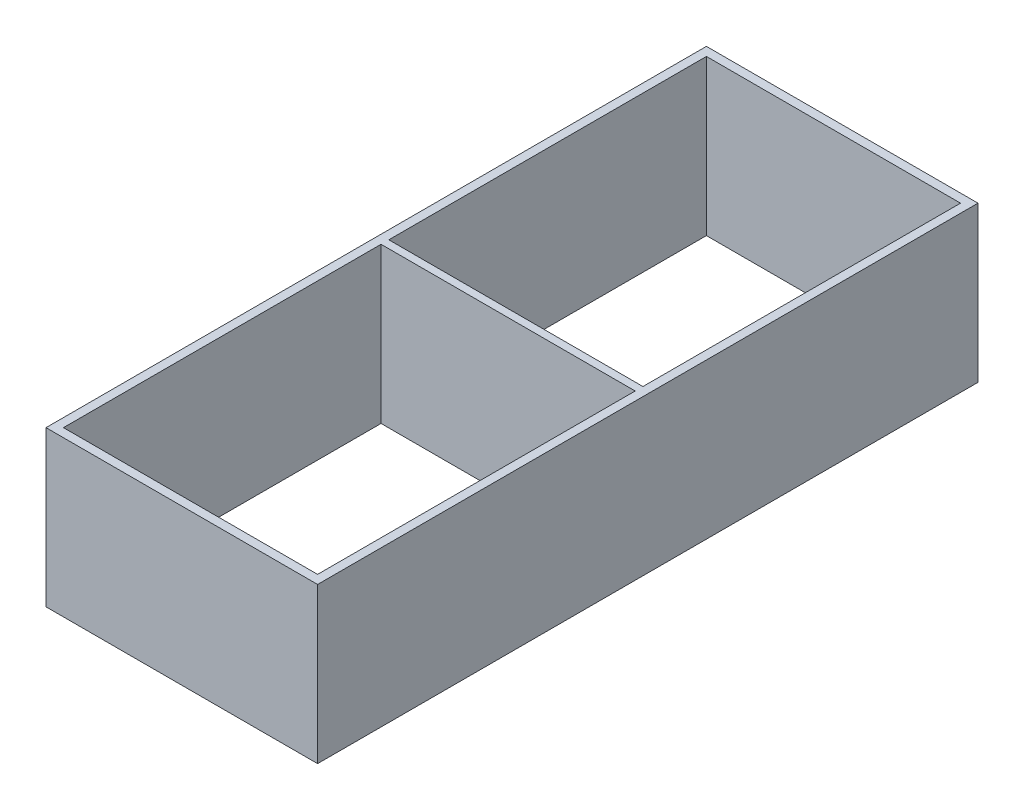
ISO-10303-21;
HEADER;
FILE_DESCRIPTION(('STEP AP214'),'2;1');
FILE_NAME('part.step','',(''),(''),'','','');
FILE_SCHEMA(('AUTOMOTIVE_DESIGN { 1 0 10303 214 1 1 1 1 }'));
ENDSEC;
DATA;
#1=APPLICATION_CONTEXT('core data for automotive mechanical design processes');
#2=APPLICATION_PROTOCOL_DEFINITION('international standard','automotive_design',2000,#1);
#3=PRODUCT_CONTEXT('',#1,'mechanical');
#4=PRODUCT('Part','Part','',(#3));
#5=PRODUCT_RELATED_PRODUCT_CATEGORY('part','',(#4));
#6=PRODUCT_DEFINITION_FORMATION('','',#4);
#7=PRODUCT_DEFINITION_CONTEXT('part definition',#1,'design');
#8=PRODUCT_DEFINITION('design','',#6,#7);
#9=PRODUCT_DEFINITION_SHAPE('','',#8);
#10=(LENGTH_UNIT() NAMED_UNIT(*) SI_UNIT(.MILLI.,.METRE.));
#11=(NAMED_UNIT(*) PLANE_ANGLE_UNIT() SI_UNIT($,.RADIAN.));
#12=(NAMED_UNIT(*) SI_UNIT($,.STERADIAN.) SOLID_ANGLE_UNIT());
#13=UNCERTAINTY_MEASURE_WITH_UNIT(LENGTH_MEASURE(1.E-05),#10,'distance_accuracy_value','');
#14=(GEOMETRIC_REPRESENTATION_CONTEXT(3) GLOBAL_UNCERTAINTY_ASSIGNED_CONTEXT((#13)) GLOBAL_UNIT_ASSIGNED_CONTEXT((#10,
#11,#12)) REPRESENTATION_CONTEXT('',''));
#15=CARTESIAN_POINT('',(0.,0.,0.));
#16=DIRECTION('',(0.,0.,1.));
#17=DIRECTION('',(1.,0.,0.));
#18=AXIS2_PLACEMENT_3D('',#15,#16,#17);
#19=CARTESIAN_POINT('',(0.,119.,0.));
#20=DIRECTION('',(0.,-1.,0.));
#21=DIRECTION('',(0.,0.,-1.));
#22=AXIS2_PLACEMENT_3D('',#19,#20,#21);
#23=PLANE('',#22);
#24=DIRECTION('',(0.,0.,1.));
#25=VECTOR('',#24,1.);
#26=CARTESIAN_POINT('',(-55.5,119.,2.));
#27=LINE('',#26,#25);
#28=CARTESIAN_POINT('',(-55.5,119.,2.));
#29=VERTEX_POINT('',#28);
#30=CARTESIAN_POINT('',(-55.5,119.,165.713675074596));
#31=VERTEX_POINT('',#30);
#32=EDGE_CURVE('E154',#29,#31,#27,.T.);
#33=ORIENTED_EDGE('',*,*,#32,.F.);
#34=DIRECTION('',(-1.,0.,0.));
#35=VECTOR('',#34,1.);
#36=CARTESIAN_POINT('',(-55.5,119.,2.));
#37=LINE('',#36,#35);
#38=CARTESIAN_POINT('',(75.5,119.,2.));
#39=VERTEX_POINT('',#38);
#40=EDGE_CURVE('E160',#39,#29,#37,.T.);
#41=ORIENTED_EDGE('',*,*,#40,.F.);
#42=DIRECTION('',(0.,0.,-1.));
#43=VECTOR('',#42,1.);
#44=CARTESIAN_POINT('',(75.5,119.,2.));
#45=LINE('',#44,#43);
#46=CARTESIAN_POINT('',(75.5,119.,165.713675074596));
#47=VERTEX_POINT('',#46);
#48=EDGE_CURVE('E158',#47,#39,#45,.T.);
#49=ORIENTED_EDGE('',*,*,#48,.F.);
#50=DIRECTION('',(1.,0.,0.));
#51=VECTOR('',#50,1.);
#52=CARTESIAN_POINT('',(-55.5,119.,165.713675074596));
#53=LINE('',#52,#51);
#54=EDGE_CURVE('E156',#31,#47,#53,.T.);
#55=ORIENTED_EDGE('',*,*,#54,.F.);
#56=EDGE_LOOP('',(#33,#41,#49,#55));
#57=FACE_BOUND('',#56,.T.);
#58=DIRECTION('',(0.,0.,-1.));
#59=VECTOR('',#58,1.);
#60=CARTESIAN_POINT('',(-60.,119.,170.213675074596));
#61=LINE('',#60,#59);
#62=CARTESIAN_POINT('',(-60.,119.,170.213675074596));
#63=VERTEX_POINT('',#62);
#64=CARTESIAN_POINT('',(-60.,119.,-170.213675074596));
#65=VERTEX_POINT('',#64);
#66=EDGE_CURVE('E170',#63,#65,#61,.T.);
#67=ORIENTED_EDGE('',*,*,#66,.F.);
#68=DIRECTION('',(-1.,0.,0.));
#69=VECTOR('',#68,1.);
#70=CARTESIAN_POINT('',(-60.,119.,170.213675074596));
#71=LINE('',#70,#69);
#72=CARTESIAN_POINT('',(80.,119.,170.213675074596));
#73=VERTEX_POINT('',#72);
#74=EDGE_CURVE('E180',#73,#63,#71,.T.);
#75=ORIENTED_EDGE('',*,*,#74,.F.);
#76=DIRECTION('',(0.,0.,1.));
#77=VECTOR('',#76,1.);
#78=CARTESIAN_POINT('',(80.,119.,170.213675074596));
#79=LINE('',#78,#77);
#80=CARTESIAN_POINT('',(80.0000000000001,119.,-170.213675074596));
#81=VERTEX_POINT('',#80);
#82=EDGE_CURVE('E177',#81,#73,#79,.T.);
#83=ORIENTED_EDGE('',*,*,#82,.F.);
#84=DIRECTION('',(1.,0.,0.));
#85=VECTOR('',#84,1.);
#86=CARTESIAN_POINT('',(-60.,119.,-170.213675074596));
#87=LINE('',#86,#85);
#88=EDGE_CURVE('E173',#65,#81,#87,.T.);
#89=ORIENTED_EDGE('',*,*,#88,.F.);
#90=EDGE_LOOP('',(#67,#75,#83,#89));
#91=FACE_BOUND('',#90,.T.);
#92=DIRECTION('',(0.,0.,1.));
#93=VECTOR('',#92,1.);
#94=CARTESIAN_POINT('',(-55.5,119.,-165.713675074596));
#95=LINE('',#94,#93);
#96=CARTESIAN_POINT('',(-55.5,119.,-165.713675074596));
#97=VERTEX_POINT('',#96);
#98=CARTESIAN_POINT('',(-55.5,119.,-2.));
#99=VERTEX_POINT('',#98);
#100=EDGE_CURVE('E124',#97,#99,#95,.T.);
#101=ORIENTED_EDGE('',*,*,#100,.F.);
#102=DIRECTION('',(-1.,0.,0.));
#103=VECTOR('',#102,1.);
#104=CARTESIAN_POINT('',(-55.5,119.,-165.713675074596));
#105=LINE('',#104,#103);
#106=CARTESIAN_POINT('',(75.5,119.,-165.713675074596));
#107=VERTEX_POINT('',#106);
#108=EDGE_CURVE('E147',#107,#97,#105,.T.);
#109=ORIENTED_EDGE('',*,*,#108,.F.);
#110=DIRECTION('',(0.,0.,-1.));
#111=VECTOR('',#110,1.);
#112=CARTESIAN_POINT('',(75.5,119.,-165.713675074596));
#113=LINE('',#112,#111);
#114=CARTESIAN_POINT('',(75.5,119.,-2.));
#115=VERTEX_POINT('',#114);
#116=EDGE_CURVE('E145',#115,#107,#113,.T.);
#117=ORIENTED_EDGE('',*,*,#116,.F.);
#118=DIRECTION('',(1.,0.,0.));
#119=VECTOR('',#118,1.);
#120=CARTESIAN_POINT('',(-55.5,119.,-2.));
#121=LINE('',#120,#119);
#122=EDGE_CURVE('E133',#99,#115,#121,.T.);
#123=ORIENTED_EDGE('',*,*,#122,.F.);
#124=EDGE_LOOP('',(#101,#109,#117,#123));
#125=FACE_BOUND('',#124,.T.);
#126=ADVANCED_FACE('F34',(#57,#91,#125),#23,.F.);
#127=CARTESIAN_POINT('',(0.,38.9999999999999,0.));
#128=DIRECTION('',(0.,-1.,0.));
#129=DIRECTION('',(0.,0.,-1.));
#130=AXIS2_PLACEMENT_3D('',#127,#128,#129);
#131=PLANE('',#130);
#132=DIRECTION('',(-1.,0.,0.));
#133=VECTOR('',#132,1.);
#134=CARTESIAN_POINT('',(0.,38.9999999999999,2.));
#135=LINE('',#134,#133);
#136=CARTESIAN_POINT('',(75.5,38.9999999999999,2.));
#137=VERTEX_POINT('',#136);
#138=CARTESIAN_POINT('',(-55.5,38.9999999999999,2.));
#139=VERTEX_POINT('',#138);
#140=EDGE_CURVE('E196',#137,#139,#135,.T.);
#141=ORIENTED_EDGE('',*,*,#140,.T.);
#142=DIRECTION('',(0.,0.,1.));
#143=VECTOR('',#142,1.);
#144=CARTESIAN_POINT('',(-55.5,38.9999999999999,0.));
#145=LINE('',#144,#143);
#146=CARTESIAN_POINT('',(-55.5,38.9999999999999,165.713675074596));
#147=VERTEX_POINT('',#146);
#148=EDGE_CURVE('E210',#139,#147,#145,.T.);
#149=ORIENTED_EDGE('',*,*,#148,.T.);
#150=DIRECTION('',(1.,0.,0.));
#151=VECTOR('',#150,1.);
#152=CARTESIAN_POINT('',(0.,38.9999999999999,165.713675074596));
#153=LINE('',#152,#151);
#154=CARTESIAN_POINT('',(75.5,38.9999999999999,165.713675074596));
#155=VERTEX_POINT('',#154);
#156=EDGE_CURVE('E207',#147,#155,#153,.T.);
#157=ORIENTED_EDGE('',*,*,#156,.T.);
#158=DIRECTION('',(0.,0.,-1.));
#159=VECTOR('',#158,1.);
#160=CARTESIAN_POINT('',(75.5,38.9999999999999,0.));
#161=LINE('',#160,#159);
#162=EDGE_CURVE('E204',#155,#137,#161,.T.);
#163=ORIENTED_EDGE('',*,*,#162,.T.);
#164=EDGE_LOOP('',(#141,#149,#157,#163));
#165=FACE_BOUND('',#164,.T.);
#166=DIRECTION('',(0.,0.,-1.));
#167=VECTOR('',#166,1.);
#168=CARTESIAN_POINT('',(-60.,38.9999999999999,170.213675074596));
#169=LINE('',#168,#167);
#170=CARTESIAN_POINT('',(-60.,38.9999999999999,170.213675074596));
#171=VERTEX_POINT('',#170);
#172=CARTESIAN_POINT('',(-60.,38.9999999999999,-170.213675074596));
#173=VERTEX_POINT('',#172);
#174=EDGE_CURVE('E141',#171,#173,#169,.T.);
#175=ORIENTED_EDGE('',*,*,#174,.T.);
#176=DIRECTION('',(1.,0.,0.));
#177=VECTOR('',#176,1.);
#178=CARTESIAN_POINT('',(-60.,38.9999999999999,-170.213675074596));
#179=LINE('',#178,#177);
#180=CARTESIAN_POINT('',(80.0000000000001,38.9999999999999,-170.213675074596));
#181=VERTEX_POINT('',#180);
#182=EDGE_CURVE('E186',#173,#181,#179,.T.);
#183=ORIENTED_EDGE('',*,*,#182,.T.);
#184=DIRECTION('',(0.,0.,1.));
#185=VECTOR('',#184,1.);
#186=CARTESIAN_POINT('',(80.,38.9999999999999,170.213675074596));
#187=LINE('',#186,#185);
#188=CARTESIAN_POINT('',(80.,38.9999999999999,170.213675074596));
#189=VERTEX_POINT('',#188);
#190=EDGE_CURVE('E189',#181,#189,#187,.T.);
#191=ORIENTED_EDGE('',*,*,#190,.T.);
#192=DIRECTION('',(-1.,0.,0.));
#193=VECTOR('',#192,1.);
#194=CARTESIAN_POINT('',(-60.,38.9999999999999,170.213675074596));
#195=LINE('',#194,#193);
#196=EDGE_CURVE('E174',#189,#171,#195,.T.);
#197=ORIENTED_EDGE('',*,*,#196,.T.);
#198=EDGE_LOOP('',(#175,#183,#191,#197));
#199=FACE_BOUND('',#198,.T.);
#200=DIRECTION('',(-1.,0.,0.));
#201=VECTOR('',#200,1.);
#202=CARTESIAN_POINT('',(0.,38.9999999999999,-165.713675074596));
#203=LINE('',#202,#201);
#204=CARTESIAN_POINT('',(75.5,38.9999999999999,-165.713675074596));
#205=VERTEX_POINT('',#204);
#206=CARTESIAN_POINT('',(-55.5,38.9999999999999,-165.713675074596));
#207=VERTEX_POINT('',#206);
#208=EDGE_CURVE('E213',#205,#207,#203,.T.);
#209=ORIENTED_EDGE('',*,*,#208,.T.);
#210=DIRECTION('',(0.,0.,1.));
#211=VECTOR('',#210,1.);
#212=CARTESIAN_POINT('',(-55.5,38.9999999999999,0.));
#213=LINE('',#212,#211);
#214=CARTESIAN_POINT('',(-55.5,38.9999999999999,-2.));
#215=VERTEX_POINT('',#214);
#216=EDGE_CURVE('E11',#207,#215,#213,.T.);
#217=ORIENTED_EDGE('',*,*,#216,.T.);
#218=DIRECTION('',(1.,0.,0.));
#219=VECTOR('',#218,1.);
#220=CARTESIAN_POINT('',(0.,38.9999999999999,-2.));
#221=LINE('',#220,#219);
#222=CARTESIAN_POINT('',(75.5,38.9999999999999,-2.));
#223=VERTEX_POINT('',#222);
#224=EDGE_CURVE('E42',#215,#223,#221,.T.);
#225=ORIENTED_EDGE('',*,*,#224,.T.);
#226=DIRECTION('',(0.,0.,-1.));
#227=VECTOR('',#226,1.);
#228=CARTESIAN_POINT('',(75.5,38.9999999999999,0.));
#229=LINE('',#228,#227);
#230=EDGE_CURVE('E216',#223,#205,#229,.T.);
#231=ORIENTED_EDGE('',*,*,#230,.T.);
#232=EDGE_LOOP('',(#209,#217,#225,#231));
#233=FACE_BOUND('',#232,.T.);
#234=ADVANCED_FACE('F219',(#165,#199,#233),#131,.T.);
#235=CARTESIAN_POINT('',(-60.,119.,170.213675074596));
#236=DIRECTION('',(-1.,0.,0.));
#237=DIRECTION('',(0.,0.,1.));
#238=AXIS2_PLACEMENT_3D('',#235,#236,#237);
#239=PLANE('',#238);
#240=ORIENTED_EDGE('',*,*,#174,.F.);
#241=DIRECTION('',(0.,-1.,0.));
#242=VECTOR('',#241,1.);
#243=CARTESIAN_POINT('',(-60.,119.,170.213675074596));
#244=LINE('',#243,#242);
#245=EDGE_CURVE('E194',#63,#171,#244,.T.);
#246=ORIENTED_EDGE('',*,*,#245,.F.);
#247=ORIENTED_EDGE('',*,*,#66,.T.);
#248=DIRECTION('',(0.,-1.,0.));
#249=VECTOR('',#248,1.);
#250=CARTESIAN_POINT('',(-60.,119.,-170.213675074596));
#251=LINE('',#250,#249);
#252=EDGE_CURVE('E183',#65,#173,#251,.T.);
#253=ORIENTED_EDGE('',*,*,#252,.T.);
#254=EDGE_LOOP('',(#240,#246,#247,#253));
#255=FACE_BOUND('',#254,.T.);
#256=ADVANCED_FACE('F36',(#255),#239,.T.);
#257=CARTESIAN_POINT('',(-60.,119.,170.213675074596));
#258=DIRECTION('',(0.,0.,1.));
#259=DIRECTION('',(0.,-1.,0.));
#260=AXIS2_PLACEMENT_3D('',#257,#258,#259);
#261=PLANE('',#260);
#262=ORIENTED_EDGE('',*,*,#196,.F.);
#263=DIRECTION('',(0.,-1.,0.));
#264=VECTOR('',#263,1.);
#265=CARTESIAN_POINT('',(80.,119.,170.213675074596));
#266=LINE('',#265,#264);
#267=EDGE_CURVE('E197',#73,#189,#266,.T.);
#268=ORIENTED_EDGE('',*,*,#267,.F.);
#269=ORIENTED_EDGE('',*,*,#74,.T.);
#270=ORIENTED_EDGE('',*,*,#245,.T.);
#271=EDGE_LOOP('',(#262,#268,#269,#270));
#272=FACE_BOUND('',#271,.T.);
#273=ADVANCED_FACE('F246',(#272),#261,.T.);
#274=CARTESIAN_POINT('',(80.,119.,170.213675074596));
#275=DIRECTION('',(1.,0.,0.));
#276=DIRECTION('',(0.,0.,-1.));
#277=AXIS2_PLACEMENT_3D('',#274,#275,#276);
#278=PLANE('',#277);
#279=ORIENTED_EDGE('',*,*,#190,.F.);
#280=DIRECTION('',(0.,-1.,0.));
#281=VECTOR('',#280,1.);
#282=CARTESIAN_POINT('',(80.0000000000001,119.,-170.213675074596));
#283=LINE('',#282,#281);
#284=EDGE_CURVE('E199',#81,#181,#283,.T.);
#285=ORIENTED_EDGE('',*,*,#284,.F.);
#286=ORIENTED_EDGE('',*,*,#82,.T.);
#287=ORIENTED_EDGE('',*,*,#267,.T.);
#288=EDGE_LOOP('',(#279,#285,#286,#287));
#289=FACE_BOUND('',#288,.T.);
#290=ADVANCED_FACE('F249',(#289),#278,.T.);
#291=CARTESIAN_POINT('',(-60.,119.,-170.213675074596));
#292=DIRECTION('',(0.,0.,-1.));
#293=DIRECTION('',(0.,1.,0.));
#294=AXIS2_PLACEMENT_3D('',#291,#292,#293);
#295=PLANE('',#294);
#296=ORIENTED_EDGE('',*,*,#182,.F.);
#297=ORIENTED_EDGE('',*,*,#252,.F.);
#298=ORIENTED_EDGE('',*,*,#88,.T.);
#299=ORIENTED_EDGE('',*,*,#284,.T.);
#300=EDGE_LOOP('',(#296,#297,#298,#299));
#301=FACE_BOUND('',#300,.T.);
#302=ADVANCED_FACE('F252',(#301),#295,.T.);
#303=CARTESIAN_POINT('',(-55.5,119.,2.));
#304=DIRECTION('',(1.,0.,0.));
#305=DIRECTION('',(0.,0.,-1.));
#306=AXIS2_PLACEMENT_3D('',#303,#304,#305);
#307=PLANE('',#306);
#308=DIRECTION('',(0.,-1.,0.));
#309=VECTOR('',#308,1.);
#310=CARTESIAN_POINT('',(-55.5,119.,2.));
#311=LINE('',#310,#309);
#312=EDGE_CURVE('E162',#29,#139,#311,.T.);
#313=ORIENTED_EDGE('',*,*,#312,.F.);
#314=ORIENTED_EDGE('',*,*,#32,.T.);
#315=DIRECTION('',(0.,-1.,0.));
#316=VECTOR('',#315,1.);
#317=CARTESIAN_POINT('',(-55.5,119.,165.713675074596));
#318=LINE('',#317,#316);
#319=EDGE_CURVE('E134',#31,#147,#318,.T.);
#320=ORIENTED_EDGE('',*,*,#319,.T.);
#321=ORIENTED_EDGE('',*,*,#148,.F.);
#322=EDGE_LOOP('',(#313,#314,#320,#321));
#323=FACE_BOUND('',#322,.T.);
#324=ADVANCED_FACE('F243',(#323),#307,.T.);
#325=CARTESIAN_POINT('',(-55.5,119.,165.713675074596));
#326=DIRECTION('',(0.,0.,-1.));
#327=DIRECTION('',(-1.,0.,0.));
#328=AXIS2_PLACEMENT_3D('',#325,#326,#327);
#329=PLANE('',#328);
#330=ORIENTED_EDGE('',*,*,#319,.F.);
#331=ORIENTED_EDGE('',*,*,#54,.T.);
#332=DIRECTION('',(0.,-1.,0.));
#333=VECTOR('',#332,1.);
#334=CARTESIAN_POINT('',(75.5,119.,165.713675074596));
#335=LINE('',#334,#333);
#336=EDGE_CURVE('E165',#47,#155,#335,.T.);
#337=ORIENTED_EDGE('',*,*,#336,.T.);
#338=ORIENTED_EDGE('',*,*,#156,.F.);
#339=EDGE_LOOP('',(#330,#331,#337,#338));
#340=FACE_BOUND('',#339,.T.);
#341=ADVANCED_FACE('F260',(#340),#329,.T.);
#342=CARTESIAN_POINT('',(75.5,119.,2.));
#343=DIRECTION('',(-1.,0.,0.));
#344=DIRECTION('',(0.,0.,1.));
#345=AXIS2_PLACEMENT_3D('',#342,#343,#344);
#346=PLANE('',#345);
#347=ORIENTED_EDGE('',*,*,#336,.F.);
#348=ORIENTED_EDGE('',*,*,#48,.T.);
#349=DIRECTION('',(0.,-1.,0.));
#350=VECTOR('',#349,1.);
#351=CARTESIAN_POINT('',(75.5,119.,2.));
#352=LINE('',#351,#350);
#353=EDGE_CURVE('E57',#39,#137,#352,.T.);
#354=ORIENTED_EDGE('',*,*,#353,.T.);
#355=ORIENTED_EDGE('',*,*,#162,.F.);
#356=EDGE_LOOP('',(#347,#348,#354,#355));
#357=FACE_BOUND('',#356,.T.);
#358=ADVANCED_FACE('F311',(#357),#346,.T.);
#359=CARTESIAN_POINT('',(-55.5,119.,2.));
#360=DIRECTION('',(0.,0.,1.));
#361=DIRECTION('',(1.,0.,0.));
#362=AXIS2_PLACEMENT_3D('',#359,#360,#361);
#363=PLANE('',#362);
#364=ORIENTED_EDGE('',*,*,#353,.F.);
#365=ORIENTED_EDGE('',*,*,#40,.T.);
#366=ORIENTED_EDGE('',*,*,#312,.T.);
#367=ORIENTED_EDGE('',*,*,#140,.F.);
#368=EDGE_LOOP('',(#364,#365,#366,#367));
#369=FACE_BOUND('',#368,.T.);
#370=ADVANCED_FACE('F319',(#369),#363,.T.);
#371=CARTESIAN_POINT('',(-55.5,119.,-165.713675074596));
#372=DIRECTION('',(1.,0.,0.));
#373=DIRECTION('',(0.,0.,-1.));
#374=AXIS2_PLACEMENT_3D('',#371,#372,#373);
#375=PLANE('',#374);
#376=DIRECTION('',(0.,-1.,0.));
#377=VECTOR('',#376,1.);
#378=CARTESIAN_POINT('',(-55.5,119.,-165.713675074596));
#379=LINE('',#378,#377);
#380=EDGE_CURVE('E129',#97,#207,#379,.T.);
#381=ORIENTED_EDGE('',*,*,#380,.F.);
#382=ORIENTED_EDGE('',*,*,#100,.T.);
#383=DIRECTION('',(0.,-1.,0.));
#384=VECTOR('',#383,1.);
#385=CARTESIAN_POINT('',(-55.5,119.,-2.));
#386=LINE('',#385,#384);
#387=EDGE_CURVE('E128',#99,#215,#386,.T.);
#388=ORIENTED_EDGE('',*,*,#387,.T.);
#389=ORIENTED_EDGE('',*,*,#216,.F.);
#390=EDGE_LOOP('',(#381,#382,#388,#389));
#391=FACE_BOUND('',#390,.T.);
#392=ADVANCED_FACE('F126',(#391),#375,.T.);
#393=CARTESIAN_POINT('',(-55.5,119.,-2.));
#394=DIRECTION('',(0.,0.,-1.));
#395=DIRECTION('',(-1.,0.,0.));
#396=AXIS2_PLACEMENT_3D('',#393,#394,#395);
#397=PLANE('',#396);
#398=ORIENTED_EDGE('',*,*,#387,.F.);
#399=ORIENTED_EDGE('',*,*,#122,.T.);
#400=DIRECTION('',(0.,-1.,0.));
#401=VECTOR('',#400,1.);
#402=CARTESIAN_POINT('',(75.5,119.,-2.));
#403=LINE('',#402,#401);
#404=EDGE_CURVE('E142',#115,#223,#403,.T.);
#405=ORIENTED_EDGE('',*,*,#404,.T.);
#406=ORIENTED_EDGE('',*,*,#224,.F.);
#407=EDGE_LOOP('',(#398,#399,#405,#406));
#408=FACE_BOUND('',#407,.T.);
#409=ADVANCED_FACE('F137',(#408),#397,.T.);
#410=CARTESIAN_POINT('',(75.5,119.,-165.713675074596));
#411=DIRECTION('',(-1.,0.,0.));
#412=DIRECTION('',(0.,0.,1.));
#413=AXIS2_PLACEMENT_3D('',#410,#411,#412);
#414=PLANE('',#413);
#415=ORIENTED_EDGE('',*,*,#404,.F.);
#416=ORIENTED_EDGE('',*,*,#116,.T.);
#417=DIRECTION('',(0.,-1.,0.));
#418=VECTOR('',#417,1.);
#419=CARTESIAN_POINT('',(75.5,119.,-165.713675074596));
#420=LINE('',#419,#418);
#421=EDGE_CURVE('E49',#107,#205,#420,.T.);
#422=ORIENTED_EDGE('',*,*,#421,.T.);
#423=ORIENTED_EDGE('',*,*,#230,.F.);
#424=EDGE_LOOP('',(#415,#416,#422,#423));
#425=FACE_BOUND('',#424,.T.);
#426=ADVANCED_FACE('F222',(#425),#414,.T.);
#427=CARTESIAN_POINT('',(-55.5,119.,-165.713675074596));
#428=DIRECTION('',(0.,0.,1.));
#429=DIRECTION('',(1.,0.,0.));
#430=AXIS2_PLACEMENT_3D('',#427,#428,#429);
#431=PLANE('',#430);
#432=ORIENTED_EDGE('',*,*,#421,.F.);
#433=ORIENTED_EDGE('',*,*,#108,.T.);
#434=ORIENTED_EDGE('',*,*,#380,.T.);
#435=ORIENTED_EDGE('',*,*,#208,.F.);
#436=EDGE_LOOP('',(#432,#433,#434,#435));
#437=FACE_BOUND('',#436,.T.);
#438=ADVANCED_FACE('F220',(#437),#431,.T.);
#439=CLOSED_SHELL('',(#126,#234,#256,#273,#290,#302,#324,#341,#358,#370,#392,#409,#426,#438));
#440=MANIFOLD_SOLID_BREP('B2',#439);
#441=ADVANCED_BREP_SHAPE_REPRESENTATION('',(#18,#440),#14);
#442=SHAPE_DEFINITION_REPRESENTATION(#9,#441);
ENDSEC;
END-ISO-10303-21;
